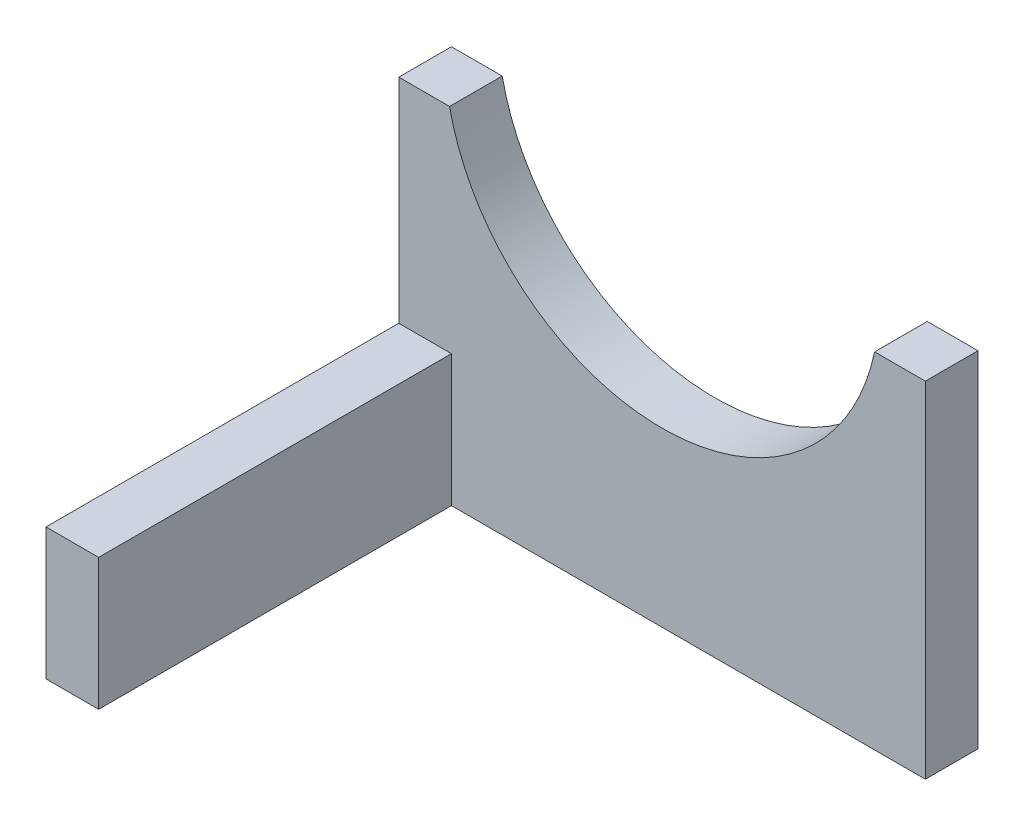
ISO-10303-21;
HEADER;
FILE_DESCRIPTION(('STEP AP214'),'2;1');
FILE_NAME('part.step','',(''),(''),'','','');
FILE_SCHEMA(('AUTOMOTIVE_DESIGN { 1 0 10303 214 1 1 1 1 }'));
ENDSEC;
DATA;
#1=APPLICATION_CONTEXT('core data for automotive mechanical design processes');
#2=APPLICATION_PROTOCOL_DEFINITION('international standard','automotive_design',2000,#1);
#3=PRODUCT_CONTEXT('',#1,'mechanical');
#4=PRODUCT('Part','Part','',(#3));
#5=PRODUCT_RELATED_PRODUCT_CATEGORY('part','',(#4));
#6=PRODUCT_DEFINITION_FORMATION('','',#4);
#7=PRODUCT_DEFINITION_CONTEXT('part definition',#1,'design');
#8=PRODUCT_DEFINITION('design','',#6,#7);
#9=PRODUCT_DEFINITION_SHAPE('','',#8);
#10=(LENGTH_UNIT() NAMED_UNIT(*) SI_UNIT(.MILLI.,.METRE.));
#11=(NAMED_UNIT(*) PLANE_ANGLE_UNIT() SI_UNIT($,.RADIAN.));
#12=(NAMED_UNIT(*) SI_UNIT($,.STERADIAN.) SOLID_ANGLE_UNIT());
#13=UNCERTAINTY_MEASURE_WITH_UNIT(LENGTH_MEASURE(1.E-05),#10,'distance_accuracy_value','');
#14=(GEOMETRIC_REPRESENTATION_CONTEXT(3) GLOBAL_UNCERTAINTY_ASSIGNED_CONTEXT((#13)) GLOBAL_UNIT_ASSIGNED_CONTEXT((#10,
#11,#12)) REPRESENTATION_CONTEXT('',''));
#15=CARTESIAN_POINT('',(0.,0.,0.));
#16=DIRECTION('',(0.,0.,1.));
#17=DIRECTION('',(1.,0.,0.));
#18=AXIS2_PLACEMENT_3D('',#15,#16,#17);
#19=CARTESIAN_POINT('',(25.4,37.5869762360446,5.08));
#20=DIRECTION('',(0.,0.,-1.));
#21=DIRECTION('',(-1.,0.,0.));
#22=AXIS2_PLACEMENT_3D('',#19,#20,#21);
#23=CYLINDRICAL_SURFACE('',#22,20.955);
#24=CARTESIAN_POINT('',(25.4,37.5869762360446,0.));
#25=DIRECTION('',(0.,0.,1.));
#26=DIRECTION('',(1.,0.,0.));
#27=AXIS2_PLACEMENT_3D('',#24,#25,#26);
#28=CIRCLE('',#27,20.955);
#29=CARTESIAN_POINT('',(4.89576896013223,33.2639524720892,0.));
#30=VERTEX_POINT('',#29);
#31=CARTESIAN_POINT('',(45.9042310398678,33.2639524720892,0.));
#32=VERTEX_POINT('',#31);
#33=EDGE_CURVE('E105',#30,#32,#28,.T.);
#34=ORIENTED_EDGE('',*,*,#33,.F.);
#35=DIRECTION('',(0.,0.,-1.));
#36=VECTOR('',#35,1.);
#37=CARTESIAN_POINT('',(4.89576896013223,33.2639524720892,5.08));
#38=LINE('',#37,#36);
#39=CARTESIAN_POINT('',(4.89576896013223,33.2639524720892,5.08));
#40=VERTEX_POINT('',#39);
#41=EDGE_CURVE('E11',#40,#30,#38,.T.);
#42=ORIENTED_EDGE('',*,*,#41,.F.);
#43=CARTESIAN_POINT('',(25.4,37.5869762360446,5.08));
#44=DIRECTION('',(0.,0.,1.));
#45=DIRECTION('',(1.,0.,0.));
#46=AXIS2_PLACEMENT_3D('',#43,#44,#45);
#47=CIRCLE('',#46,20.955);
#48=CARTESIAN_POINT('',(45.9042310398678,33.2639524720892,5.08));
#49=VERTEX_POINT('',#48);
#50=EDGE_CURVE('E133',#40,#49,#47,.T.);
#51=ORIENTED_EDGE('',*,*,#50,.T.);
#52=DIRECTION('',(0.,0.,-1.));
#53=VECTOR('',#52,1.);
#54=CARTESIAN_POINT('',(45.9042310398678,33.2639524720892,5.08));
#55=LINE('',#54,#53);
#56=EDGE_CURVE('E147',#49,#32,#55,.T.);
#57=ORIENTED_EDGE('',*,*,#56,.T.);
#58=EDGE_LOOP('',(#34,#42,#51,#57));
#59=FACE_BOUND('',#58,.T.);
#60=ADVANCED_FACE('F35',(#59),#23,.F.);
#61=CARTESIAN_POINT('',(0.,33.2639524720892,5.08));
#62=DIRECTION('',(0.,-1.,0.));
#63=DIRECTION('',(0.,0.,-1.));
#64=AXIS2_PLACEMENT_3D('',#61,#62,#63);
#65=PLANE('',#64);
#66=DIRECTION('',(-1.,0.,0.));
#67=VECTOR('',#66,1.);
#68=CARTESIAN_POINT('',(0.,33.2639524720892,0.));
#69=LINE('',#68,#67);
#70=CARTESIAN_POINT('',(0.,33.2639524720892,0.));
#71=VERTEX_POINT('',#70);
#72=EDGE_CURVE('E150',#30,#71,#69,.T.);
#73=ORIENTED_EDGE('',*,*,#72,.T.);
#74=DIRECTION('',(0.,0.,-1.));
#75=VECTOR('',#74,1.);
#76=CARTESIAN_POINT('',(0.,33.2639524720892,5.08));
#77=LINE('',#76,#75);
#78=CARTESIAN_POINT('',(0.,33.2639524720892,5.08));
#79=VERTEX_POINT('',#78);
#80=EDGE_CURVE('E42',#79,#71,#77,.T.);
#81=ORIENTED_EDGE('',*,*,#80,.F.);
#82=DIRECTION('',(-1.,0.,0.));
#83=VECTOR('',#82,1.);
#84=CARTESIAN_POINT('',(0.,33.2639524720892,5.08));
#85=LINE('',#84,#83);
#86=EDGE_CURVE('E136',#40,#79,#85,.T.);
#87=ORIENTED_EDGE('',*,*,#86,.F.);
#88=ORIENTED_EDGE('',*,*,#41,.T.);
#89=EDGE_LOOP('',(#73,#81,#87,#88));
#90=FACE_BOUND('',#89,.T.);
#91=ADVANCED_FACE('F177',(#90),#65,.F.);
#92=CARTESIAN_POINT('',(0.,0.,5.08));
#93=DIRECTION('',(-1.,0.,0.));
#94=DIRECTION('',(0.,0.,1.));
#95=AXIS2_PLACEMENT_3D('',#92,#93,#94);
#96=PLANE('',#95);
#97=DIRECTION('',(0.,1.,0.));
#98=VECTOR('',#97,1.);
#99=CARTESIAN_POINT('',(0.,0.,0.));
#100=LINE('',#99,#98);
#101=CARTESIAN_POINT('',(0.,0.,0.));
#102=VERTEX_POINT('',#101);
#103=EDGE_CURVE('E153',#102,#71,#100,.T.);
#104=ORIENTED_EDGE('',*,*,#103,.F.);
#105=DIRECTION('',(0.,0.,-1.));
#106=VECTOR('',#105,1.);
#107=CARTESIAN_POINT('',(0.,0.,5.08));
#108=LINE('',#107,#106);
#109=CARTESIAN_POINT('',(0.,0.,39.116));
#110=VERTEX_POINT('',#109);
#111=EDGE_CURVE('E169',#110,#102,#108,.T.);
#112=ORIENTED_EDGE('',*,*,#111,.F.);
#113=DIRECTION('',(0.,-1.,0.));
#114=VECTOR('',#113,1.);
#115=CARTESIAN_POINT('',(0.,0.,39.116));
#116=LINE('',#115,#114);
#117=CARTESIAN_POINT('',(0.,12.7,39.116));
#118=VERTEX_POINT('',#117);
#119=EDGE_CURVE('E120',#118,#110,#116,.T.);
#120=ORIENTED_EDGE('',*,*,#119,.F.);
#121=DIRECTION('',(0.,0.,1.));
#122=VECTOR('',#121,1.);
#123=CARTESIAN_POINT('',(0.,12.7,5.08));
#124=LINE('',#123,#122);
#125=CARTESIAN_POINT('',(0.,12.7,5.08));
#126=VERTEX_POINT('',#125);
#127=EDGE_CURVE('E123',#126,#118,#124,.T.);
#128=ORIENTED_EDGE('',*,*,#127,.F.);
#129=DIRECTION('',(0.,1.,0.));
#130=VECTOR('',#129,1.);
#131=CARTESIAN_POINT('',(0.,0.,5.08));
#132=LINE('',#131,#130);
#133=EDGE_CURVE('E55',#126,#79,#132,.T.);
#134=ORIENTED_EDGE('',*,*,#133,.T.);
#135=ORIENTED_EDGE('',*,*,#80,.T.);
#136=EDGE_LOOP('',(#104,#112,#120,#128,#134,#135));
#137=FACE_BOUND('',#136,.T.);
#138=ADVANCED_FACE('F173',(#137),#96,.T.);
#139=CARTESIAN_POINT('',(0.,0.,5.08));
#140=DIRECTION('',(0.,1.,0.));
#141=DIRECTION('',(0.,0.,1.));
#142=AXIS2_PLACEMENT_3D('',#139,#140,#141);
#143=PLANE('',#142);
#144=DIRECTION('',(1.,0.,0.));
#145=VECTOR('',#144,1.);
#146=CARTESIAN_POINT('',(0.,0.,0.));
#147=LINE('',#146,#145);
#148=CARTESIAN_POINT('',(50.8,0.,0.));
#149=VERTEX_POINT('',#148);
#150=EDGE_CURVE('E156',#102,#149,#147,.T.);
#151=ORIENTED_EDGE('',*,*,#150,.T.);
#152=DIRECTION('',(0.,0.,-1.));
#153=VECTOR('',#152,1.);
#154=CARTESIAN_POINT('',(50.8,0.,5.08));
#155=LINE('',#154,#153);
#156=CARTESIAN_POINT('',(50.8,0.,5.08));
#157=VERTEX_POINT('',#156);
#158=EDGE_CURVE('E166',#157,#149,#155,.T.);
#159=ORIENTED_EDGE('',*,*,#158,.F.);
#160=DIRECTION('',(1.,0.,0.));
#161=VECTOR('',#160,1.);
#162=CARTESIAN_POINT('',(0.,0.,5.08));
#163=LINE('',#162,#161);
#164=CARTESIAN_POINT('',(5.08,0.,5.08));
#165=VERTEX_POINT('',#164);
#166=EDGE_CURVE('E140',#165,#157,#163,.T.);
#167=ORIENTED_EDGE('',*,*,#166,.F.);
#168=DIRECTION('',(0.,0.,-1.));
#169=VECTOR('',#168,1.);
#170=CARTESIAN_POINT('',(5.08,0.,5.08));
#171=LINE('',#170,#169);
#172=CARTESIAN_POINT('',(5.08,0.,39.116));
#173=VERTEX_POINT('',#172);
#174=EDGE_CURVE('E119',#173,#165,#171,.T.);
#175=ORIENTED_EDGE('',*,*,#174,.F.);
#176=DIRECTION('',(-1.,0.,0.));
#177=VECTOR('',#176,1.);
#178=CARTESIAN_POINT('',(5.08,0.,39.116));
#179=LINE('',#178,#177);
#180=EDGE_CURVE('E128',#173,#110,#179,.T.);
#181=ORIENTED_EDGE('',*,*,#180,.T.);
#182=ORIENTED_EDGE('',*,*,#111,.T.);
#183=EDGE_LOOP('',(#151,#159,#167,#175,#181,#182));
#184=FACE_BOUND('',#183,.T.);
#185=ADVANCED_FACE('F185',(#184),#143,.F.);
#186=CARTESIAN_POINT('',(50.8,0.,5.08));
#187=DIRECTION('',(-1.,0.,0.));
#188=DIRECTION('',(0.,0.,1.));
#189=AXIS2_PLACEMENT_3D('',#186,#187,#188);
#190=PLANE('',#189);
#191=DIRECTION('',(0.,1.,0.));
#192=VECTOR('',#191,1.);
#193=CARTESIAN_POINT('',(50.8,0.,0.));
#194=LINE('',#193,#192);
#195=CARTESIAN_POINT('',(50.8,33.2639524720892,0.));
#196=VERTEX_POINT('',#195);
#197=EDGE_CURVE('E158',#149,#196,#194,.T.);
#198=ORIENTED_EDGE('',*,*,#197,.T.);
#199=DIRECTION('',(0.,0.,-1.));
#200=VECTOR('',#199,1.);
#201=CARTESIAN_POINT('',(50.8,33.2639524720892,5.08));
#202=LINE('',#201,#200);
#203=CARTESIAN_POINT('',(50.8,33.2639524720892,5.08));
#204=VERTEX_POINT('',#203);
#205=EDGE_CURVE('E164',#204,#196,#202,.T.);
#206=ORIENTED_EDGE('',*,*,#205,.F.);
#207=DIRECTION('',(0.,1.,0.));
#208=VECTOR('',#207,1.);
#209=CARTESIAN_POINT('',(50.8,0.,5.08));
#210=LINE('',#209,#208);
#211=EDGE_CURVE('E142',#157,#204,#210,.T.);
#212=ORIENTED_EDGE('',*,*,#211,.F.);
#213=ORIENTED_EDGE('',*,*,#158,.T.);
#214=EDGE_LOOP('',(#198,#206,#212,#213));
#215=FACE_BOUND('',#214,.T.);
#216=ADVANCED_FACE('F188',(#215),#190,.F.);
#217=CARTESIAN_POINT('',(0.,33.2639524720892,5.08));
#218=DIRECTION('',(0.,1.,0.));
#219=DIRECTION('',(0.,0.,1.));
#220=AXIS2_PLACEMENT_3D('',#217,#218,#219);
#221=PLANE('',#220);
#222=DIRECTION('',(1.,0.,0.));
#223=VECTOR('',#222,1.);
#224=CARTESIAN_POINT('',(0.,33.2639524720892,0.));
#225=LINE('',#224,#223);
#226=EDGE_CURVE('E137',#32,#196,#225,.T.);
#227=ORIENTED_EDGE('',*,*,#226,.F.);
#228=ORIENTED_EDGE('',*,*,#56,.F.);
#229=DIRECTION('',(1.,0.,0.));
#230=VECTOR('',#229,1.);
#231=CARTESIAN_POINT('',(0.,33.2639524720892,5.08));
#232=LINE('',#231,#230);
#233=EDGE_CURVE('E144',#49,#204,#232,.T.);
#234=ORIENTED_EDGE('',*,*,#233,.T.);
#235=ORIENTED_EDGE('',*,*,#205,.T.);
#236=EDGE_LOOP('',(#227,#228,#234,#235));
#237=FACE_BOUND('',#236,.T.);
#238=ADVANCED_FACE('F211',(#237),#221,.T.);
#239=CARTESIAN_POINT('',(0.,0.,5.08));
#240=DIRECTION('',(0.,0.,1.));
#241=DIRECTION('',(1.,0.,0.));
#242=AXIS2_PLACEMENT_3D('',#239,#240,#241);
#243=PLANE('',#242);
#244=DIRECTION('',(-1.,0.,0.));
#245=VECTOR('',#244,1.);
#246=CARTESIAN_POINT('',(5.08,12.7,5.08));
#247=LINE('',#246,#245);
#248=CARTESIAN_POINT('',(5.08,12.7,5.08));
#249=VERTEX_POINT('',#248);
#250=EDGE_CURVE('E101',#249,#126,#247,.T.);
#251=ORIENTED_EDGE('',*,*,#250,.F.);
#252=DIRECTION('',(0.,1.,0.));
#253=VECTOR('',#252,1.);
#254=CARTESIAN_POINT('',(5.08,0.,5.08));
#255=LINE('',#254,#253);
#256=EDGE_CURVE('E49',#165,#249,#255,.T.);
#257=ORIENTED_EDGE('',*,*,#256,.F.);
#258=ORIENTED_EDGE('',*,*,#166,.T.);
#259=ORIENTED_EDGE('',*,*,#211,.T.);
#260=ORIENTED_EDGE('',*,*,#233,.F.);
#261=ORIENTED_EDGE('',*,*,#50,.F.);
#262=ORIENTED_EDGE('',*,*,#86,.T.);
#263=ORIENTED_EDGE('',*,*,#133,.F.);
#264=EDGE_LOOP('',(#251,#257,#258,#259,#260,#261,#262,#263));
#265=FACE_BOUND('',#264,.T.);
#266=ADVANCED_FACE('F103',(#265),#243,.T.);
#267=CARTESIAN_POINT('',(0.,0.,0.));
#268=DIRECTION('',(0.,0.,1.));
#269=DIRECTION('',(1.,0.,0.));
#270=AXIS2_PLACEMENT_3D('',#267,#268,#269);
#271=PLANE('',#270);
#272=ORIENTED_EDGE('',*,*,#33,.T.);
#273=ORIENTED_EDGE('',*,*,#226,.T.);
#274=ORIENTED_EDGE('',*,*,#197,.F.);
#275=ORIENTED_EDGE('',*,*,#150,.F.);
#276=ORIENTED_EDGE('',*,*,#103,.T.);
#277=ORIENTED_EDGE('',*,*,#72,.F.);
#278=EDGE_LOOP('',(#272,#273,#274,#275,#276,#277));
#279=FACE_BOUND('',#278,.T.);
#280=ADVANCED_FACE('F181',(#279),#271,.F.);
#281=CARTESIAN_POINT('',(5.08,12.7,5.08));
#282=DIRECTION('',(0.,-1.,0.));
#283=DIRECTION('',(0.,0.,-1.));
#284=AXIS2_PLACEMENT_3D('',#281,#282,#283);
#285=PLANE('',#284);
#286=ORIENTED_EDGE('',*,*,#127,.T.);
#287=DIRECTION('',(-1.,0.,0.));
#288=VECTOR('',#287,1.);
#289=CARTESIAN_POINT('',(5.08,12.7,39.116));
#290=LINE('',#289,#288);
#291=CARTESIAN_POINT('',(5.08,12.7,39.116));
#292=VERTEX_POINT('',#291);
#293=EDGE_CURVE('E106',#292,#118,#290,.T.);
#294=ORIENTED_EDGE('',*,*,#293,.F.);
#295=DIRECTION('',(0.,0.,1.));
#296=VECTOR('',#295,1.);
#297=CARTESIAN_POINT('',(5.08,12.7,5.08));
#298=LINE('',#297,#296);
#299=EDGE_CURVE('E109',#249,#292,#298,.T.);
#300=ORIENTED_EDGE('',*,*,#299,.F.);
#301=ORIENTED_EDGE('',*,*,#250,.T.);
#302=EDGE_LOOP('',(#286,#294,#300,#301));
#303=FACE_BOUND('',#302,.T.);
#304=ADVANCED_FACE('F110',(#303),#285,.F.);
#305=CARTESIAN_POINT('',(5.08,0.,39.116));
#306=DIRECTION('',(0.,0.,-1.));
#307=DIRECTION('',(-1.,0.,0.));
#308=AXIS2_PLACEMENT_3D('',#305,#306,#307);
#309=PLANE('',#308);
#310=ORIENTED_EDGE('',*,*,#119,.T.);
#311=ORIENTED_EDGE('',*,*,#180,.F.);
#312=DIRECTION('',(0.,-1.,0.));
#313=VECTOR('',#312,1.);
#314=CARTESIAN_POINT('',(5.08,0.,39.116));
#315=LINE('',#314,#313);
#316=EDGE_CURVE('E114',#292,#173,#315,.T.);
#317=ORIENTED_EDGE('',*,*,#316,.F.);
#318=ORIENTED_EDGE('',*,*,#293,.T.);
#319=EDGE_LOOP('',(#310,#311,#317,#318));
#320=FACE_BOUND('',#319,.T.);
#321=ADVANCED_FACE('F194',(#320),#309,.F.);
#322=CARTESIAN_POINT('',(5.08,0.,0.));
#323=DIRECTION('',(1.,0.,0.));
#324=DIRECTION('',(0.,0.,-1.));
#325=AXIS2_PLACEMENT_3D('',#322,#323,#324);
#326=PLANE('',#325);
#327=ORIENTED_EDGE('',*,*,#256,.T.);
#328=ORIENTED_EDGE('',*,*,#299,.T.);
#329=ORIENTED_EDGE('',*,*,#316,.T.);
#330=ORIENTED_EDGE('',*,*,#174,.T.);
#331=EDGE_LOOP('',(#327,#328,#329,#330));
#332=FACE_BOUND('',#331,.T.);
#333=ADVANCED_FACE('F117',(#332),#326,.T.);
#334=CLOSED_SHELL('',(#60,#91,#138,#185,#216,#238,#266,#280,#304,#321,#333));
#335=MANIFOLD_SOLID_BREP('B2',#334);
#336=ADVANCED_BREP_SHAPE_REPRESENTATION('',(#18,#335),#14);
#337=SHAPE_DEFINITION_REPRESENTATION(#9,#336);
ENDSEC;
END-ISO-10303-21;
